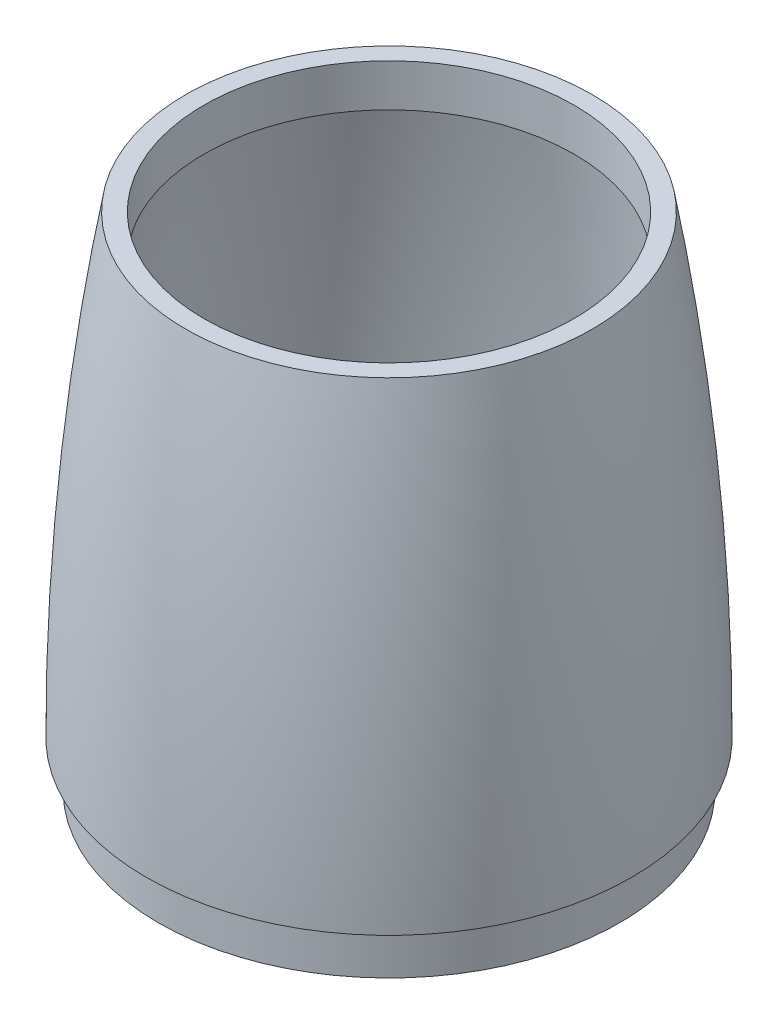
ISO-10303-21;
HEADER;
FILE_DESCRIPTION(('STEP AP214'),'2;1');
FILE_NAME('part.step','',(''),(''),'','','');
FILE_SCHEMA(('AUTOMOTIVE_DESIGN { 1 0 10303 214 1 1 1 1 }'));
ENDSEC;
DATA;
#1=APPLICATION_CONTEXT('core data for automotive mechanical design processes');
#2=APPLICATION_PROTOCOL_DEFINITION('international standard','automotive_design',2000,#1);
#3=PRODUCT_CONTEXT('',#1,'mechanical');
#4=PRODUCT('Part','Part','',(#3));
#5=PRODUCT_RELATED_PRODUCT_CATEGORY('part','',(#4));
#6=PRODUCT_DEFINITION_FORMATION('','',#4);
#7=PRODUCT_DEFINITION_CONTEXT('part definition',#1,'design');
#8=PRODUCT_DEFINITION('design','',#6,#7);
#9=PRODUCT_DEFINITION_SHAPE('','',#8);
#10=(LENGTH_UNIT() NAMED_UNIT(*) SI_UNIT(.MILLI.,.METRE.));
#11=(NAMED_UNIT(*) PLANE_ANGLE_UNIT() SI_UNIT($,.RADIAN.));
#12=(NAMED_UNIT(*) SI_UNIT($,.STERADIAN.) SOLID_ANGLE_UNIT());
#13=UNCERTAINTY_MEASURE_WITH_UNIT(LENGTH_MEASURE(1.E-05),#10,'distance_accuracy_value','');
#14=(GEOMETRIC_REPRESENTATION_CONTEXT(3) GLOBAL_UNCERTAINTY_ASSIGNED_CONTEXT((#13)) GLOBAL_UNIT_ASSIGNED_CONTEXT((#10,
#11,#12)) REPRESENTATION_CONTEXT('',''));
#15=CARTESIAN_POINT('',(0.,0.,0.));
#16=DIRECTION('',(0.,0.,1.));
#17=DIRECTION('',(1.,0.,0.));
#18=AXIS2_PLACEMENT_3D('',#15,#16,#17);
#19=CARTESIAN_POINT('',(0.,0.,0.));
#20=DIRECTION('',(0.,-1.,0.));
#21=DIRECTION('',(0.,0.,-1.));
#22=AXIS2_PLACEMENT_3D('',#19,#20,#21);
#23=DEGENERATE_TOROIDAL_SURFACE('',#22,395.942307692309,432.942307692309,.F.);
#24=CARTESIAN_POINT('',(0.,68.,0.));
#25=DIRECTION('',(0.,-1.,0.));
#26=DIRECTION('',(0.,0.,-1.));
#27=AXIS2_PLACEMENT_3D('',#24,#25,#26);
#28=CIRCLE('',#27,31.6264491058719);
#29=CARTESIAN_POINT('',(0.,68.,-31.6264491058719));
#30=VERTEX_POINT('',#29);
#31=EDGE_CURVE('E67',#30,#30,#28,.T.);
#32=ORIENTED_EDGE('',*,*,#31,.F.);
#33=EDGE_LOOP('',(#32));
#34=FACE_BOUND('',#33,.T.);
#35=CARTESIAN_POINT('',(0.,0.,0.));
#36=DIRECTION('',(0.,-1.,0.));
#37=DIRECTION('',(0.,0.,-1.));
#38=AXIS2_PLACEMENT_3D('',#35,#36,#37);
#39=CIRCLE('',#38,37.);
#40=CARTESIAN_POINT('',(0.,0.,-37.));
#41=VERTEX_POINT('',#40);
#42=EDGE_CURVE('E10',#41,#41,#39,.T.);
#43=ORIENTED_EDGE('',*,*,#42,.T.);
#44=EDGE_LOOP('',(#43));
#45=FACE_BOUND('',#44,.T.);
#46=ADVANCED_FACE('F36',(#34,#45),#23,.T.);
#47=CARTESIAN_POINT('',(0.,0.,0.));
#48=DIRECTION('',(0.,-1.,0.));
#49=DIRECTION('',(0.,0.,-1.));
#50=AXIS2_PLACEMENT_3D('',#47,#48,#49);
#51=CYLINDRICAL_SURFACE('',#50,37.);
#52=CARTESIAN_POINT('',(0.,-7.5,0.));
#53=DIRECTION('',(0.,-1.,0.));
#54=DIRECTION('',(0.,0.,-1.));
#55=AXIS2_PLACEMENT_3D('',#52,#53,#54);
#56=CIRCLE('',#55,37.);
#57=CARTESIAN_POINT('',(0.,-7.5,-37.));
#58=VERTEX_POINT('',#57);
#59=EDGE_CURVE('E42',#58,#58,#56,.T.);
#60=ORIENTED_EDGE('',*,*,#59,.T.);
#61=EDGE_LOOP('',(#60));
#62=FACE_BOUND('',#61,.T.);
#63=ORIENTED_EDGE('',*,*,#42,.F.);
#64=EDGE_LOOP('',(#63));
#65=FACE_BOUND('',#64,.T.);
#66=ADVANCED_FACE('F74',(#62,#65),#51,.F.);
#67=CARTESIAN_POINT('',(0.,-7.5,0.));
#68=DIRECTION('',(0.,-1.,0.));
#69=DIRECTION('',(0.,0.,-1.));
#70=AXIS2_PLACEMENT_3D('',#67,#68,#69);
#71=PLANE('',#70);
#72=CARTESIAN_POINT('',(0.,-7.5,0.));
#73=DIRECTION('',(0.,-1.,0.));
#74=DIRECTION('',(0.,0.,-1.));
#75=AXIS2_PLACEMENT_3D('',#72,#73,#74);
#76=CIRCLE('',#75,38.);
#77=CARTESIAN_POINT('',(0.,-7.5,-38.));
#78=VERTEX_POINT('',#77);
#79=EDGE_CURVE('E46',#78,#78,#76,.T.);
#80=ORIENTED_EDGE('',*,*,#79,.T.);
#81=EDGE_LOOP('',(#80));
#82=FACE_BOUND('',#81,.T.);
#83=ORIENTED_EDGE('',*,*,#59,.F.);
#84=EDGE_LOOP('',(#83));
#85=FACE_BOUND('',#84,.T.);
#86=ADVANCED_FACE('F78',(#82,#85),#71,.T.);
#87=CARTESIAN_POINT('',(0.,0.,0.));
#88=DIRECTION('',(0.,-1.,0.));
#89=DIRECTION('',(0.,0.,-1.));
#90=AXIS2_PLACEMENT_3D('',#87,#88,#89);
#91=CYLINDRICAL_SURFACE('',#90,38.);
#92=ORIENTED_EDGE('',*,*,#79,.F.);
#93=EDGE_LOOP('',(#92));
#94=FACE_BOUND('',#93,.T.);
#95=CARTESIAN_POINT('',(0.,0.,0.));
#96=DIRECTION('',(0.,-1.,0.));
#97=DIRECTION('',(0.,0.,-1.));
#98=AXIS2_PLACEMENT_3D('',#95,#96,#97);
#99=CIRCLE('',#98,38.);
#100=CARTESIAN_POINT('',(0.,0.,-38.));
#101=VERTEX_POINT('',#100);
#102=EDGE_CURVE('E50',#101,#101,#99,.T.);
#103=ORIENTED_EDGE('',*,*,#102,.T.);
#104=EDGE_LOOP('',(#103));
#105=FACE_BOUND('',#104,.T.);
#106=ADVANCED_FACE('F82',(#94,#105),#91,.T.);
#107=CARTESIAN_POINT('',(0.,0.,0.));
#108=DIRECTION('',(0.,-1.,0.));
#109=DIRECTION('',(0.,0.,-1.));
#110=AXIS2_PLACEMENT_3D('',#107,#108,#109);
#111=PLANE('',#110);
#112=CARTESIAN_POINT('',(0.,0.,0.));
#113=DIRECTION('',(0.,-1.,0.));
#114=DIRECTION('',(0.,0.,-1.));
#115=AXIS2_PLACEMENT_3D('',#112,#113,#114);
#116=CIRCLE('',#115,40.);
#117=CARTESIAN_POINT('',(0.,0.,-40.));
#118=VERTEX_POINT('',#117);
#119=EDGE_CURVE('E55',#118,#118,#116,.T.);
#120=ORIENTED_EDGE('',*,*,#119,.T.);
#121=EDGE_LOOP('',(#120));
#122=FACE_BOUND('',#121,.T.);
#123=ORIENTED_EDGE('',*,*,#102,.F.);
#124=EDGE_LOOP('',(#123));
#125=FACE_BOUND('',#124,.T.);
#126=ADVANCED_FACE('F89',(#122,#125),#111,.T.);
#127=CARTESIAN_POINT('',(0.,0.,0.));
#128=DIRECTION('',(0.,-1.,0.));
#129=DIRECTION('',(0.,0.,-1.));
#130=AXIS2_PLACEMENT_3D('',#127,#128,#129);
#131=DEGENERATE_TOROIDAL_SURFACE('',#130,395.942307692309,435.942307692309,.F.);
#132=CARTESIAN_POINT('',(0.,75.,0.));
#133=DIRECTION('',(0.,-1.,0.));
#134=DIRECTION('',(0.,0.,-1.));
#135=AXIS2_PLACEMENT_3D('',#132,#133,#134);
#136=CIRCLE('',#135,33.5);
#137=CARTESIAN_POINT('',(0.,75.,-33.5));
#138=VERTEX_POINT('',#137);
#139=EDGE_CURVE('E58',#138,#138,#136,.T.);
#140=ORIENTED_EDGE('',*,*,#139,.T.);
#141=EDGE_LOOP('',(#140));
#142=FACE_BOUND('',#141,.T.);
#143=ORIENTED_EDGE('',*,*,#119,.F.);
#144=EDGE_LOOP('',(#143));
#145=FACE_BOUND('',#144,.T.);
#146=ADVANCED_FACE('F93',(#142,#145),#131,.F.);
#147=CARTESIAN_POINT('',(0.,75.,0.));
#148=DIRECTION('',(0.,-1.,0.));
#149=DIRECTION('',(0.,0.,-1.));
#150=AXIS2_PLACEMENT_3D('',#147,#148,#149);
#151=PLANE('',#150);
#152=ORIENTED_EDGE('',*,*,#139,.F.);
#153=EDGE_LOOP('',(#152));
#154=FACE_BOUND('',#153,.T.);
#155=CARTESIAN_POINT('',(0.,75.,0.));
#156=DIRECTION('',(0.,-1.,0.));
#157=DIRECTION('',(0.,0.,-1.));
#158=AXIS2_PLACEMENT_3D('',#155,#156,#157);
#159=CIRCLE('',#158,30.5);
#160=CARTESIAN_POINT('',(0.,75.,-30.5));
#161=VERTEX_POINT('',#160);
#162=EDGE_CURVE('E61',#161,#161,#159,.T.);
#163=ORIENTED_EDGE('',*,*,#162,.T.);
#164=EDGE_LOOP('',(#163));
#165=FACE_BOUND('',#164,.T.);
#166=ADVANCED_FACE('F97',(#154,#165),#151,.F.);
#167=CARTESIAN_POINT('',(0.,0.,0.));
#168=DIRECTION('',(0.,-1.,0.));
#169=DIRECTION('',(0.,0.,-1.));
#170=AXIS2_PLACEMENT_3D('',#167,#168,#169);
#171=CYLINDRICAL_SURFACE('',#170,30.5);
#172=ORIENTED_EDGE('',*,*,#162,.F.);
#173=EDGE_LOOP('',(#172));
#174=FACE_BOUND('',#173,.T.);
#175=CARTESIAN_POINT('',(0.,68.,0.));
#176=DIRECTION('',(0.,-1.,0.));
#177=DIRECTION('',(0.,0.,-1.));
#178=AXIS2_PLACEMENT_3D('',#175,#176,#177);
#179=CIRCLE('',#178,30.5);
#180=CARTESIAN_POINT('',(0.,68.,-30.5));
#181=VERTEX_POINT('',#180);
#182=EDGE_CURVE('E64',#181,#181,#179,.T.);
#183=ORIENTED_EDGE('',*,*,#182,.T.);
#184=EDGE_LOOP('',(#183));
#185=FACE_BOUND('',#184,.T.);
#186=ADVANCED_FACE('F101',(#174,#185),#171,.F.);
#187=CARTESIAN_POINT('',(0.,68.,0.));
#188=DIRECTION('',(0.,1.,0.));
#189=DIRECTION('',(0.,0.,1.));
#190=AXIS2_PLACEMENT_3D('',#187,#188,#189);
#191=PLANE('',#190);
#192=ORIENTED_EDGE('',*,*,#182,.F.);
#193=EDGE_LOOP('',(#192));
#194=FACE_BOUND('',#193,.T.);
#195=ORIENTED_EDGE('',*,*,#31,.T.);
#196=EDGE_LOOP('',(#195));
#197=FACE_BOUND('',#196,.T.);
#198=ADVANCED_FACE('F71',(#194,#197),#191,.F.);
#199=CLOSED_SHELL('',(#46,#66,#86,#106,#126,#146,#166,#186,#198));
#200=MANIFOLD_SOLID_BREP('B2',#199);
#201=ADVANCED_BREP_SHAPE_REPRESENTATION('',(#18,#200),#14);
#202=SHAPE_DEFINITION_REPRESENTATION(#9,#201);
ENDSEC;
END-ISO-10303-21;
